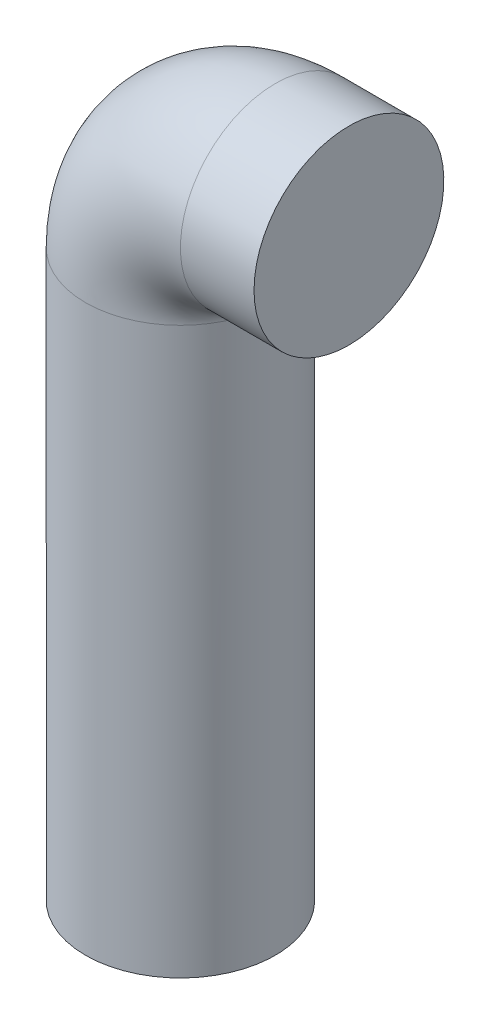
ISO-10303-21;
HEADER;
FILE_DESCRIPTION(('STEP AP214'),'2;1');
FILE_NAME('part.step','',(''),(''),'','','');
FILE_SCHEMA(('AUTOMOTIVE_DESIGN { 1 0 10303 214 1 1 1 1 }'));
ENDSEC;
DATA;
#1=APPLICATION_CONTEXT('core data for automotive mechanical design processes');
#2=APPLICATION_PROTOCOL_DEFINITION('international standard','automotive_design',2000,#1);
#3=PRODUCT_CONTEXT('',#1,'mechanical');
#4=PRODUCT('Part','Part','',(#3));
#5=PRODUCT_RELATED_PRODUCT_CATEGORY('part','',(#4));
#6=PRODUCT_DEFINITION_FORMATION('','',#4);
#7=PRODUCT_DEFINITION_CONTEXT('part definition',#1,'design');
#8=PRODUCT_DEFINITION('design','',#6,#7);
#9=PRODUCT_DEFINITION_SHAPE('','',#8);
#10=(LENGTH_UNIT() NAMED_UNIT(*) SI_UNIT(.MILLI.,.METRE.));
#11=(NAMED_UNIT(*) PLANE_ANGLE_UNIT() SI_UNIT($,.RADIAN.));
#12=(NAMED_UNIT(*) SI_UNIT($,.STERADIAN.) SOLID_ANGLE_UNIT());
#13=UNCERTAINTY_MEASURE_WITH_UNIT(LENGTH_MEASURE(1.E-05),#10,'distance_accuracy_value','');
#14=(GEOMETRIC_REPRESENTATION_CONTEXT(3) GLOBAL_UNCERTAINTY_ASSIGNED_CONTEXT((#13)) GLOBAL_UNIT_ASSIGNED_CONTEXT((#10,
#11,#12)) REPRESENTATION_CONTEXT('',''));
#15=CARTESIAN_POINT('',(0.,0.,0.));
#16=DIRECTION('',(0.,0.,1.));
#17=DIRECTION('',(1.,0.,0.));
#18=AXIS2_PLACEMENT_3D('',#15,#16,#17);
#19=CARTESIAN_POINT('',(0.,0.,0.));
#20=DIRECTION('',(0.,1.,0.));
#21=DIRECTION('',(0.,0.,1.));
#22=AXIS2_PLACEMENT_3D('',#19,#20,#21);
#23=PLANE('',#22);
#24=CARTESIAN_POINT('',(0.,0.,0.));
#25=DIRECTION('',(0.,1.,0.));
#26=DIRECTION('',(0.,0.,1.));
#27=AXIS2_PLACEMENT_3D('',#24,#25,#26);
#28=CIRCLE('',#27,25.);
#29=CARTESIAN_POINT('',(0.,0.,25.));
#30=VERTEX_POINT('',#29);
#31=EDGE_CURVE('E65',#30,#30,#28,.T.);
#32=ORIENTED_EDGE('',*,*,#31,.F.);
#33=EDGE_LOOP('',(#32));
#34=FACE_BOUND('',#33,.T.);
#35=ADVANCED_FACE('F47',(#34),#23,.F.);
#36=CARTESIAN_POINT('',(44.39,173.9,0.));
#37=DIRECTION('',(1.,0.,0.));
#38=DIRECTION('',(0.,0.,1.));
#39=AXIS2_PLACEMENT_3D('',#36,#37,#38);
#40=PLANE('',#39);
#41=CARTESIAN_POINT('',(44.39,173.9,0.));
#42=DIRECTION('',(1.,0.,0.));
#43=DIRECTION('',(0.,0.,1.));
#44=AXIS2_PLACEMENT_3D('',#41,#42,#43);
#45=CIRCLE('',#44,25.);
#46=CARTESIAN_POINT('',(44.39,173.9,25.));
#47=VERTEX_POINT('',#46);
#48=EDGE_CURVE('E11',#47,#47,#45,.T.);
#49=ORIENTED_EDGE('',*,*,#48,.T.);
#50=EDGE_LOOP('',(#49));
#51=FACE_BOUND('',#50,.T.);
#52=ADVANCED_FACE('F74',(#51),#40,.T.);
#53=CARTESIAN_POINT('',(0.,0.,0.));
#54=DIRECTION('',(0.,1.,0.));
#55=DIRECTION('',(0.,0.,1.));
#56=AXIS2_PLACEMENT_3D('',#53,#54,#55);
#57=CYLINDRICAL_SURFACE('',#56,25.);
#58=CARTESIAN_POINT('',(0.,148.9,0.));
#59=DIRECTION('',(0.,1.,0.));
#60=DIRECTION('',(0.,0.,1.));
#61=AXIS2_PLACEMENT_3D('',#58,#59,#60);
#62=CIRCLE('',#61,25.);
#63=CARTESIAN_POINT('',(25.,148.9,0.));
#64=VERTEX_POINT('',#63);
#65=EDGE_CURVE('E58',#64,#64,#62,.T.);
#66=ORIENTED_EDGE('',*,*,#65,.F.);
#67=EDGE_LOOP('',(#66));
#68=FACE_BOUND('',#67,.T.);
#69=ORIENTED_EDGE('',*,*,#31,.T.);
#70=EDGE_LOOP('',(#69));
#71=FACE_BOUND('',#70,.T.);
#72=ADVANCED_FACE('F59',(#68,#71),#57,.T.);
#73=CARTESIAN_POINT('',(0.,148.9,0.));
#74=DIRECTION('',(0.,-1.,0.));
#75=DIRECTION('',(-1.,0.,0.));
#76=AXIS2_PLACEMENT_3D('',#73,#74,#75);
#77=CIRCLE('',#76,25.);
#78=TRIMMED_CURVE('',#77,(PARAMETER_VALUE(-3.14159263868863)),
(PARAMETER_VALUE(3.14159263868863)),.T.,.PARAMETER.);
#79=CARTESIAN_POINT('',(25.,148.9,0.));
#80=DIRECTION('',(0.,0.,-1.));
#81=AXIS1_PLACEMENT('',#79,#80);
#82=SURFACE_OF_REVOLUTION('',#78,#81);
#83=CARTESIAN_POINT('',(25.,173.9,0.));
#84=DIRECTION('',(1.,0.,0.));
#85=DIRECTION('',(0.,0.,1.));
#86=AXIS2_PLACEMENT_3D('',#83,#84,#85);
#87=CIRCLE('',#86,25.);
#88=EDGE_CURVE('E54',#64,#64,#87,.T.);
#89=ORIENTED_EDGE('',*,*,#88,.F.);
#90=ORIENTED_EDGE('',*,*,#65,.T.);
#91=EDGE_LOOP('',(#89,#90));
#92=FACE_BOUND('',#91,.T.);
#93=ADVANCED_FACE('F81',(#92),#82,.T.);
#94=CARTESIAN_POINT('',(25.,173.9,0.));
#95=DIRECTION('',(1.,0.,0.));
#96=DIRECTION('',(0.,0.,-1.));
#97=AXIS2_PLACEMENT_3D('',#94,#95,#96);
#98=CYLINDRICAL_SURFACE('',#97,25.);
#99=ORIENTED_EDGE('',*,*,#48,.F.);
#100=EDGE_LOOP('',(#99));
#101=FACE_BOUND('',#100,.T.);
#102=ORIENTED_EDGE('',*,*,#88,.T.);
#103=EDGE_LOOP('',(#102));
#104=FACE_BOUND('',#103,.T.);
#105=ADVANCED_FACE('F79',(#101,#104),#98,.T.);
#106=CLOSED_SHELL('',(#35,#52,#72,#93,#105));
#107=MANIFOLD_SOLID_BREP('B2',#106);
#108=ADVANCED_BREP_SHAPE_REPRESENTATION('',(#18,#107),#14);
#109=SHAPE_DEFINITION_REPRESENTATION(#9,#108);
ENDSEC;
END-ISO-10303-21;
